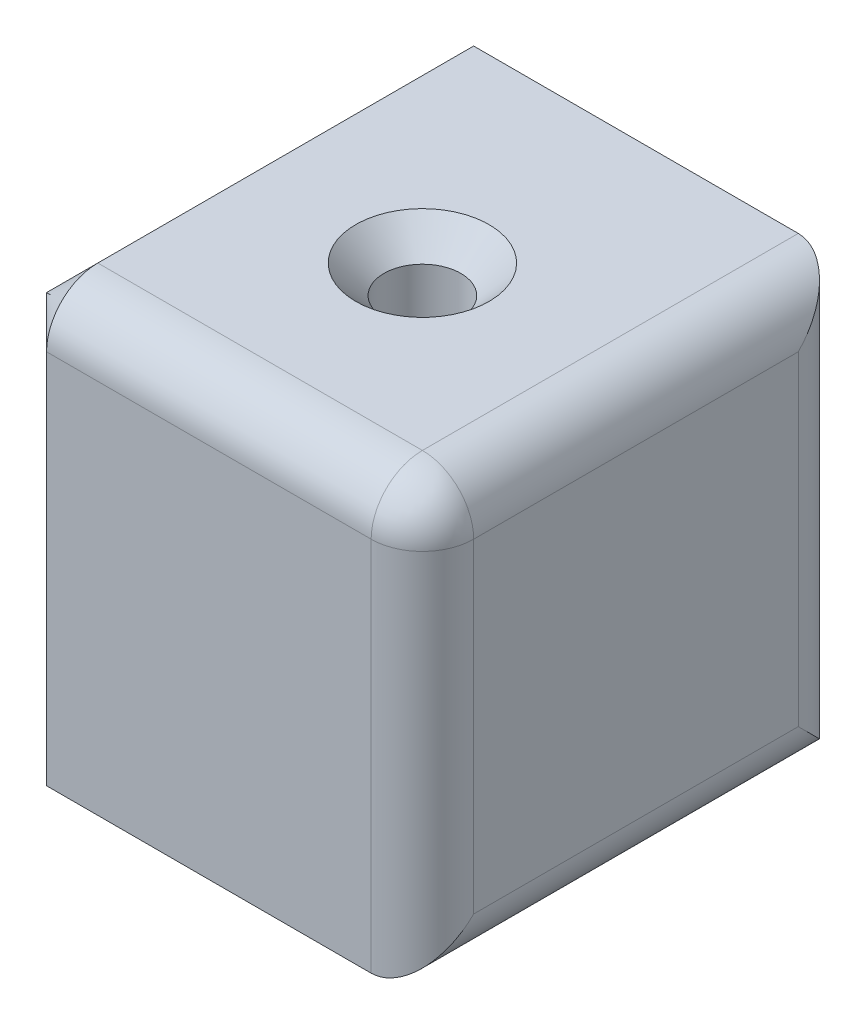
ISO-10303-21;
HEADER;
FILE_DESCRIPTION(('STEP AP214'),'2;1');
FILE_NAME('part.step','',(''),(''),'','','');
FILE_SCHEMA(('AUTOMOTIVE_DESIGN { 1 0 10303 214 1 1 1 1 }'));
ENDSEC;
DATA;
#1=APPLICATION_CONTEXT('core data for automotive mechanical design processes');
#2=APPLICATION_PROTOCOL_DEFINITION('international standard','automotive_design',2000,#1);
#3=PRODUCT_CONTEXT('',#1,'mechanical');
#4=PRODUCT('Part','Part','',(#3));
#5=PRODUCT_RELATED_PRODUCT_CATEGORY('part','',(#4));
#6=PRODUCT_DEFINITION_FORMATION('','',#4);
#7=PRODUCT_DEFINITION_CONTEXT('part definition',#1,'design');
#8=PRODUCT_DEFINITION('design','',#6,#7);
#9=PRODUCT_DEFINITION_SHAPE('','',#8);
#10=(LENGTH_UNIT() NAMED_UNIT(*) SI_UNIT(.MILLI.,.METRE.));
#11=(NAMED_UNIT(*) PLANE_ANGLE_UNIT() SI_UNIT($,.RADIAN.));
#12=(NAMED_UNIT(*) SI_UNIT($,.STERADIAN.) SOLID_ANGLE_UNIT());
#13=UNCERTAINTY_MEASURE_WITH_UNIT(LENGTH_MEASURE(1.E-05),#10,'distance_accuracy_value','');
#14=(GEOMETRIC_REPRESENTATION_CONTEXT(3) GLOBAL_UNCERTAINTY_ASSIGNED_CONTEXT((#13)) GLOBAL_UNIT_ASSIGNED_CONTEXT((#10,
#11,#12)) REPRESENTATION_CONTEXT('',''));
#15=CARTESIAN_POINT('',(0.,0.,0.));
#16=DIRECTION('',(0.,0.,1.));
#17=DIRECTION('',(1.,0.,0.));
#18=AXIS2_PLACEMENT_3D('',#15,#16,#17);
#19=CARTESIAN_POINT('',(0.,0.,25.));
#20=DIRECTION('',(1.,0.,0.));
#21=DIRECTION('',(0.,0.,-1.));
#22=AXIS2_PLACEMENT_3D('',#19,#20,#21);
#23=PLANE('',#22);
#24=DIRECTION('',(0.,0.,-1.));
#25=VECTOR('',#24,1.);
#26=CARTESIAN_POINT('',(0.,22.,25.));
#27=LINE('',#26,#25);
#28=CARTESIAN_POINT('',(0.,22.,22.));
#29=VERTEX_POINT('',#28);
#30=CARTESIAN_POINT('',(0.,22.,4.65685424949239));
#31=VERTEX_POINT('',#30);
#32=EDGE_CURVE('E184',#29,#31,#27,.T.);
#33=ORIENTED_EDGE('',*,*,#32,.T.);
#34=DIRECTION('',(0.,-1.,0.));
#35=VECTOR('',#34,1.);
#36=CARTESIAN_POINT('',(0.,3.00000000000001,4.65685424949239));
#37=LINE('',#36,#35);
#38=CARTESIAN_POINT('',(0.,3.00000000000001,4.65685424949239));
#39=VERTEX_POINT('',#38);
#40=EDGE_CURVE('E198',#31,#39,#37,.T.);
#41=ORIENTED_EDGE('',*,*,#40,.T.);
#42=DIRECTION('',(0.,0.,1.));
#43=VECTOR('',#42,1.);
#44=CARTESIAN_POINT('',(0.,3.00000000000001,25.));
#45=LINE('',#44,#43);
#46=CARTESIAN_POINT('',(0.,3.00000000000001,22.));
#47=VERTEX_POINT('',#46);
#48=EDGE_CURVE('E187',#39,#47,#45,.T.);
#49=ORIENTED_EDGE('',*,*,#48,.T.);
#50=DIRECTION('',(0.,1.,0.));
#51=VECTOR('',#50,1.);
#52=CARTESIAN_POINT('',(0.,0.,22.));
#53=LINE('',#52,#51);
#54=EDGE_CURVE('E182',#47,#29,#53,.T.);
#55=ORIENTED_EDGE('',*,*,#54,.T.);
#56=EDGE_LOOP('',(#33,#41,#49,#55));
#57=FACE_BOUND('',#56,.T.);
#58=ADVANCED_FACE('F47',(#57),#23,.F.);
#59=CARTESIAN_POINT('',(0.,0.,25.));
#60=DIRECTION('',(0.,1.,0.));
#61=DIRECTION('',(0.,0.,1.));
#62=AXIS2_PLACEMENT_3D('',#59,#60,#61);
#63=PLANE('',#62);
#64=CARTESIAN_POINT('',(12.5,0.,12.5));
#65=DIRECTION('',(0.,1.,0.));
#66=DIRECTION('',(0.,0.,1.));
#67=AXIS2_PLACEMENT_3D('',#64,#65,#66);
#68=CIRCLE('',#67,2.25);
#69=CARTESIAN_POINT('',(12.5,0.,14.75));
#70=VERTEX_POINT('',#69);
#71=EDGE_CURVE('E438',#70,#70,#68,.T.);
#72=ORIENTED_EDGE('',*,*,#71,.T.);
#73=EDGE_LOOP('',(#72));
#74=FACE_BOUND('',#73,.T.);
#75=DIRECTION('',(1.,0.,0.));
#76=VECTOR('',#75,1.);
#77=CARTESIAN_POINT('',(0.,0.,25.));
#78=LINE('',#77,#76);
#79=CARTESIAN_POINT('',(3.00000000000001,0.,25.));
#80=VERTEX_POINT('',#79);
#81=CARTESIAN_POINT('',(22.,0.,25.));
#82=VERTEX_POINT('',#81);
#83=EDGE_CURVE('E144',#80,#82,#78,.T.);
#84=ORIENTED_EDGE('',*,*,#83,.F.);
#85=DIRECTION('',(0.,0.,-1.));
#86=VECTOR('',#85,1.);
#87=CARTESIAN_POINT('',(3.00000000000001,0.,25.));
#88=LINE('',#87,#86);
#89=CARTESIAN_POINT('',(3.00000000000001,0.,0.));
#90=VERTEX_POINT('',#89);
#91=EDGE_CURVE('E166',#80,#90,#88,.T.);
#92=ORIENTED_EDGE('',*,*,#91,.T.);
#93=DIRECTION('',(1.,0.,0.));
#94=VECTOR('',#93,1.);
#95=CARTESIAN_POINT('',(0.,0.,0.));
#96=LINE('',#95,#94);
#97=CARTESIAN_POINT('',(22.,0.,0.));
#98=VERTEX_POINT('',#97);
#99=EDGE_CURVE('E435',#90,#98,#96,.T.);
#100=ORIENTED_EDGE('',*,*,#99,.T.);
#101=DIRECTION('',(0.,0.,-1.));
#102=VECTOR('',#101,1.);
#103=CARTESIAN_POINT('',(22.,0.,25.));
#104=LINE('',#103,#102);
#105=EDGE_CURVE('E130',#98,#82,#104,.F.);
#106=ORIENTED_EDGE('',*,*,#105,.T.);
#107=EDGE_LOOP('',(#84,#92,#100,#106));
#108=FACE_BOUND('',#107,.T.);
#109=ADVANCED_FACE('F240',(#74,#108),#63,.F.);
#110=CARTESIAN_POINT('',(25.,0.,25.));
#111=DIRECTION('',(-1.,0.,0.));
#112=DIRECTION('',(0.,0.,1.));
#113=AXIS2_PLACEMENT_3D('',#110,#111,#112);
#114=PLANE('',#113);
#115=DIRECTION('',(0.,1.,0.));
#116=VECTOR('',#115,1.);
#117=CARTESIAN_POINT('',(25.,0.,22.));
#118=LINE('',#117,#116);
#119=CARTESIAN_POINT('',(25.,22.,22.));
#120=VERTEX_POINT('',#119);
#121=CARTESIAN_POINT('',(25.,3.,22.));
#122=VERTEX_POINT('',#121);
#123=EDGE_CURVE('E148',#120,#122,#118,.F.);
#124=ORIENTED_EDGE('',*,*,#123,.T.);
#125=DIRECTION('',(0.,0.,-1.));
#126=VECTOR('',#125,1.);
#127=CARTESIAN_POINT('',(25.,3.,25.));
#128=LINE('',#127,#126);
#129=CARTESIAN_POINT('',(25.,3.,3.));
#130=VERTEX_POINT('',#129);
#131=EDGE_CURVE('E128',#122,#130,#128,.T.);
#132=ORIENTED_EDGE('',*,*,#131,.T.);
#133=DIRECTION('',(0.,1.,0.));
#134=VECTOR('',#133,1.);
#135=CARTESIAN_POINT('',(25.,25.,3.));
#136=LINE('',#135,#134);
#137=CARTESIAN_POINT('',(25.,22.,3.));
#138=VERTEX_POINT('',#137);
#139=EDGE_CURVE('E137',#130,#138,#136,.T.);
#140=ORIENTED_EDGE('',*,*,#139,.T.);
#141=DIRECTION('',(0.,0.,-1.));
#142=VECTOR('',#141,1.);
#143=CARTESIAN_POINT('',(25.,22.,25.));
#144=LINE('',#143,#142);
#145=EDGE_CURVE('E143',#138,#120,#144,.F.);
#146=ORIENTED_EDGE('',*,*,#145,.T.);
#147=EDGE_LOOP('',(#124,#132,#140,#146));
#148=FACE_BOUND('',#147,.T.);
#149=ADVANCED_FACE('F146',(#148),#114,.F.);
#150=CARTESIAN_POINT('',(0.,25.,25.));
#151=DIRECTION('',(0.,-1.,0.));
#152=DIRECTION('',(0.,0.,-1.));
#153=AXIS2_PLACEMENT_3D('',#150,#151,#152);
#154=PLANE('',#153);
#155=CARTESIAN_POINT('',(12.5,25.,12.5));
#156=DIRECTION('',(0.,1.,0.));
#157=DIRECTION('',(0.,0.,1.));
#158=AXIS2_PLACEMENT_3D('',#155,#156,#157);
#159=CIRCLE('',#158,3.9);
#160=CARTESIAN_POINT('',(12.5,25.,16.4));
#161=VERTEX_POINT('',#160);
#162=EDGE_CURVE('E179',#161,#161,#159,.T.);
#163=ORIENTED_EDGE('',*,*,#162,.F.);
#164=EDGE_LOOP('',(#163));
#165=FACE_BOUND('',#164,.T.);
#166=DIRECTION('',(-1.,0.,0.));
#167=VECTOR('',#166,1.);
#168=CARTESIAN_POINT('',(0.,25.,0.));
#169=LINE('',#168,#167);
#170=CARTESIAN_POINT('',(22.,25.,0.));
#171=VERTEX_POINT('',#170);
#172=CARTESIAN_POINT('',(3.00000000000001,25.,0.));
#173=VERTEX_POINT('',#172);
#174=EDGE_CURVE('E432',#171,#173,#169,.T.);
#175=ORIENTED_EDGE('',*,*,#174,.T.);
#176=DIRECTION('',(0.,0.,1.));
#177=VECTOR('',#176,1.);
#178=CARTESIAN_POINT('',(3.00000000000001,25.,25.));
#179=LINE('',#178,#177);
#180=CARTESIAN_POINT('',(3.00000000000001,25.,22.));
#181=VERTEX_POINT('',#180);
#182=EDGE_CURVE('E192',#173,#181,#179,.T.);
#183=ORIENTED_EDGE('',*,*,#182,.T.);
#184=DIRECTION('',(-1.,0.,0.));
#185=VECTOR('',#184,1.);
#186=CARTESIAN_POINT('',(0.,25.,22.));
#187=LINE('',#186,#185);
#188=CARTESIAN_POINT('',(22.,25.,22.));
#189=VERTEX_POINT('',#188);
#190=EDGE_CURVE('E160',#181,#189,#187,.F.);
#191=ORIENTED_EDGE('',*,*,#190,.T.);
#192=DIRECTION('',(0.,0.,-1.));
#193=VECTOR('',#192,1.);
#194=CARTESIAN_POINT('',(22.,25.,25.));
#195=LINE('',#194,#193);
#196=EDGE_CURVE('E162',#189,#171,#195,.T.);
#197=ORIENTED_EDGE('',*,*,#196,.T.);
#198=EDGE_LOOP('',(#175,#183,#191,#197));
#199=FACE_BOUND('',#198,.T.);
#200=ADVANCED_FACE('F388',(#165,#199),#154,.F.);
#201=CARTESIAN_POINT('',(0.,0.,25.));
#202=DIRECTION('',(0.,0.,-1.));
#203=DIRECTION('',(-1.,0.,0.));
#204=AXIS2_PLACEMENT_3D('',#201,#202,#203);
#205=PLANE('',#204);
#206=DIRECTION('',(-1.,0.,0.));
#207=VECTOR('',#206,1.);
#208=CARTESIAN_POINT('',(0.,22.,25.));
#209=LINE('',#208,#207);
#210=CARTESIAN_POINT('',(22.,22.,25.));
#211=VERTEX_POINT('',#210);
#212=CARTESIAN_POINT('',(3.00000000000001,22.,25.));
#213=VERTEX_POINT('',#212);
#214=EDGE_CURVE('E151',#211,#213,#209,.T.);
#215=ORIENTED_EDGE('',*,*,#214,.T.);
#216=DIRECTION('',(0.,-1.,0.));
#217=VECTOR('',#216,1.);
#218=CARTESIAN_POINT('',(3.00000000000001,0.,25.));
#219=LINE('',#218,#217);
#220=EDGE_CURVE('E196',#213,#80,#219,.T.);
#221=ORIENTED_EDGE('',*,*,#220,.T.);
#222=ORIENTED_EDGE('',*,*,#83,.T.);
#223=DIRECTION('',(0.,1.,0.));
#224=VECTOR('',#223,1.);
#225=CARTESIAN_POINT('',(22.,0.,25.));
#226=LINE('',#225,#224);
#227=EDGE_CURVE('E158',#82,#211,#226,.T.);
#228=ORIENTED_EDGE('',*,*,#227,.T.);
#229=EDGE_LOOP('',(#215,#221,#222,#228));
#230=FACE_BOUND('',#229,.T.);
#231=ADVANCED_FACE('F379',(#230),#205,.F.);
#232=CARTESIAN_POINT('',(0.,0.,0.));
#233=DIRECTION('',(0.,0.,-1.));
#234=DIRECTION('',(-1.,0.,0.));
#235=AXIS2_PLACEMENT_3D('',#232,#233,#234);
#236=PLANE('',#235);
#237=ORIENTED_EDGE('',*,*,#99,.F.);
#238=DIRECTION('',(0.,1.,0.));
#239=VECTOR('',#238,1.);
#240=CARTESIAN_POINT('',(3.00000000000001,25.,0.));
#241=LINE('',#240,#239);
#242=EDGE_CURVE('E189',#90,#173,#241,.T.);
#243=ORIENTED_EDGE('',*,*,#242,.T.);
#244=ORIENTED_EDGE('',*,*,#174,.F.);
#245=DIRECTION('',(0.,1.,0.));
#246=VECTOR('',#245,1.);
#247=CARTESIAN_POINT('',(22.,0.,0.));
#248=LINE('',#247,#246);
#249=EDGE_CURVE('E164',#171,#98,#248,.F.);
#250=ORIENTED_EDGE('',*,*,#249,.T.);
#251=EDGE_LOOP('',(#237,#243,#244,#250));
#252=FACE_BOUND('',#251,.T.);
#253=ADVANCED_FACE('F371',(#252),#236,.T.);
#254=CARTESIAN_POINT('',(12.5,25.,12.5));
#255=DIRECTION('',(0.,1.,0.));
#256=DIRECTION('',(0.,0.,1.));
#257=AXIS2_PLACEMENT_3D('',#254,#255,#256);
#258=CYLINDRICAL_SURFACE('',#257,2.25);
#259=ORIENTED_EDGE('',*,*,#71,.F.);
#260=EDGE_LOOP('',(#259));
#261=FACE_BOUND('',#260,.T.);
#262=CARTESIAN_POINT('',(12.5,23.35,12.5));
#263=DIRECTION('',(0.,1.,0.));
#264=DIRECTION('',(0.,0.,1.));
#265=AXIS2_PLACEMENT_3D('',#262,#263,#264);
#266=CIRCLE('',#265,2.25);
#267=CARTESIAN_POINT('',(12.5,23.35,14.75));
#268=VERTEX_POINT('',#267);
#269=EDGE_CURVE('E452',#268,#268,#266,.T.);
#270=ORIENTED_EDGE('',*,*,#269,.T.);
#271=EDGE_LOOP('',(#270));
#272=FACE_BOUND('',#271,.T.);
#273=ADVANCED_FACE('F362',(#261,#272),#258,.F.);
#274=CARTESIAN_POINT('',(12.5,25.,12.5));
#275=DIRECTION('',(0.,1.,0.));
#276=DIRECTION('',(0.,0.,1.));
#277=AXIS2_PLACEMENT_3D('',#274,#275,#276);
#278=CONICAL_SURFACE('',#277,3.9,0.785398163397443);
#279=ORIENTED_EDGE('',*,*,#269,.F.);
#280=EDGE_LOOP('',(#279));
#281=FACE_BOUND('',#280,.T.);
#282=ORIENTED_EDGE('',*,*,#162,.T.);
#283=EDGE_LOOP('',(#282));
#284=FACE_BOUND('',#283,.T.);
#285=ADVANCED_FACE('F269',(#281,#284),#278,.F.);
#286=CARTESIAN_POINT('',(0.,22.,22.));
#287=DIRECTION('',(-1.,0.,0.));
#288=DIRECTION('',(0.,0.,1.));
#289=AXIS2_PLACEMENT_3D('',#286,#287,#288);
#290=CYLINDRICAL_SURFACE('',#289,3.);
#291=ORIENTED_EDGE('',*,*,#190,.F.);
#292=CARTESIAN_POINT('',(3.00000000000001,22.,22.));
#293=DIRECTION('',(1.,0.,0.));
#294=DIRECTION('',(0.,0.,-1.));
#295=AXIS2_PLACEMENT_3D('',#292,#293,#294);
#296=CIRCLE('',#295,3.);
#297=EDGE_CURVE('E194',#181,#213,#296,.T.);
#298=ORIENTED_EDGE('',*,*,#297,.T.);
#299=ORIENTED_EDGE('',*,*,#214,.F.);
#300=CARTESIAN_POINT('',(22.,22.,22.));
#301=DIRECTION('',(1.,0.,0.));
#302=DIRECTION('',(0.,0.,-1.));
#303=AXIS2_PLACEMENT_3D('',#300,#301,#302);
#304=CIRCLE('',#303,3.);
#305=EDGE_CURVE('E176',#189,#211,#304,.T.);
#306=ORIENTED_EDGE('',*,*,#305,.F.);
#307=EDGE_LOOP('',(#291,#298,#299,#306));
#308=FACE_BOUND('',#307,.T.);
#309=ADVANCED_FACE('F266',(#308),#290,.T.);
#310=CARTESIAN_POINT('',(22.,22.,22.));
#311=DIRECTION('',(0.,1.,0.));
#312=DIRECTION('',(0.,0.,1.));
#313=AXIS2_PLACEMENT_3D('',#310,#311,#312);
#314=SPHERICAL_SURFACE('',#313,3.);
#315=CARTESIAN_POINT('',(22.,22.,22.));
#316=DIRECTION('',(0.,1.,0.));
#317=DIRECTION('',(0.,0.,1.));
#318=AXIS2_PLACEMENT_3D('',#315,#316,#317);
#319=CIRCLE('',#318,3.);
#320=EDGE_CURVE('E170',#120,#211,#319,.F.);
#321=ORIENTED_EDGE('',*,*,#320,.F.);
#322=CARTESIAN_POINT('',(22.,22.,22.));
#323=DIRECTION('',(0.,0.,1.));
#324=DIRECTION('',(1.,0.,0.));
#325=AXIS2_PLACEMENT_3D('',#322,#323,#324);
#326=CIRCLE('',#325,3.);
#327=EDGE_CURVE('E173',#189,#120,#326,.F.);
#328=ORIENTED_EDGE('',*,*,#327,.F.);
#329=ORIENTED_EDGE('',*,*,#305,.T.);
#330=EDGE_LOOP('',(#321,#328,#329));
#331=FACE_BOUND('',#330,.T.);
#332=ADVANCED_FACE('F262',(#331),#314,.T.);
#333=CARTESIAN_POINT('',(22.,22.,25.));
#334=DIRECTION('',(0.,0.,-1.));
#335=DIRECTION('',(-1.,0.,0.));
#336=AXIS2_PLACEMENT_3D('',#333,#334,#335);
#337=CYLINDRICAL_SURFACE('',#336,3.);
#338=ORIENTED_EDGE('',*,*,#327,.T.);
#339=ORIENTED_EDGE('',*,*,#145,.F.);
#340=CARTESIAN_POINT('',(22.,22.,3.));
#341=DIRECTION('',(0.,-0.707106781186547,-0.707106781186547));
#342=DIRECTION('',(0.,-0.707106781186547,0.707106781186547));
#343=AXIS2_PLACEMENT_3D('',#340,#341,#342);
#344=ELLIPSE('',#343,4.24264068711928,3.);
#345=EDGE_CURVE('E140',#171,#138,#344,.T.);
#346=ORIENTED_EDGE('',*,*,#345,.F.);
#347=ORIENTED_EDGE('',*,*,#196,.F.);
#348=EDGE_LOOP('',(#338,#339,#346,#347));
#349=FACE_BOUND('',#348,.T.);
#350=ADVANCED_FACE('F258',(#349),#337,.T.);
#351=CARTESIAN_POINT('',(22.,0.,22.));
#352=DIRECTION('',(0.,1.,0.));
#353=DIRECTION('',(0.,0.,1.));
#354=AXIS2_PLACEMENT_3D('',#351,#352,#353);
#355=CYLINDRICAL_SURFACE('',#354,3.);
#356=ORIENTED_EDGE('',*,*,#320,.T.);
#357=ORIENTED_EDGE('',*,*,#227,.F.);
#358=CARTESIAN_POINT('',(22.,3.,22.));
#359=DIRECTION('',(0.,0.707106781186547,0.707106781186547));
#360=DIRECTION('',(0.,0.707106781186547,-0.707106781186547));
#361=AXIS2_PLACEMENT_3D('',#358,#359,#360);
#362=ELLIPSE('',#361,4.24264068711928,3.);
#363=EDGE_CURVE('E133',#122,#82,#362,.F.);
#364=ORIENTED_EDGE('',*,*,#363,.F.);
#365=ORIENTED_EDGE('',*,*,#123,.F.);
#366=EDGE_LOOP('',(#356,#357,#364,#365));
#367=FACE_BOUND('',#366,.T.);
#368=ADVANCED_FACE('F255',(#367),#355,.T.);
#369=CARTESIAN_POINT('',(22.,0.,3.));
#370=DIRECTION('',(0.,-1.,0.));
#371=DIRECTION('',(0.,0.,-1.));
#372=AXIS2_PLACEMENT_3D('',#369,#370,#371);
#373=CYLINDRICAL_SURFACE('',#372,3.);
#374=ORIENTED_EDGE('',*,*,#345,.T.);
#375=ORIENTED_EDGE('',*,*,#139,.F.);
#376=CARTESIAN_POINT('',(22.,3.,3.));
#377=DIRECTION('',(0.,-0.707106781186547,0.707106781186547));
#378=DIRECTION('',(0.,-0.707106781186547,-0.707106781186547));
#379=AXIS2_PLACEMENT_3D('',#376,#377,#378);
#380=ELLIPSE('',#379,4.24264068711928,3.);
#381=EDGE_CURVE('E123',#98,#130,#380,.T.);
#382=ORIENTED_EDGE('',*,*,#381,.F.);
#383=ORIENTED_EDGE('',*,*,#249,.F.);
#384=EDGE_LOOP('',(#374,#375,#382,#383));
#385=FACE_BOUND('',#384,.T.);
#386=ADVANCED_FACE('F138',(#385),#373,.T.);
#387=CARTESIAN_POINT('',(22.,3.,25.));
#388=DIRECTION('',(0.,0.,-1.));
#389=DIRECTION('',(-1.,0.,0.));
#390=AXIS2_PLACEMENT_3D('',#387,#388,#389);
#391=CYLINDRICAL_SURFACE('',#390,3.);
#392=ORIENTED_EDGE('',*,*,#363,.T.);
#393=ORIENTED_EDGE('',*,*,#105,.F.);
#394=ORIENTED_EDGE('',*,*,#381,.T.);
#395=ORIENTED_EDGE('',*,*,#131,.F.);
#396=EDGE_LOOP('',(#392,#393,#394,#395));
#397=FACE_BOUND('',#396,.T.);
#398=ADVANCED_FACE('F126',(#397),#391,.T.);
#399=CARTESIAN_POINT('',(3.00000000000001,22.,22.));
#400=DIRECTION('',(1.,0.,0.));
#401=DIRECTION('',(0.,0.,-1.));
#402=AXIS2_PLACEMENT_3D('',#399,#400,#401);
#403=CONICAL_SURFACE('',#402,3.00000000000001,0.785398163397448);
#404=DIRECTION('',(-0.707106781186547,0.,-0.707106781186547));
#405=VECTOR('',#404,1.);
#406=CARTESIAN_POINT('',(3.00000000000001,22.,25.));
#407=LINE('',#406,#405);
#408=EDGE_CURVE('E206',#213,#29,#407,.T.);
#409=ORIENTED_EDGE('',*,*,#408,.F.);
#410=ORIENTED_EDGE('',*,*,#297,.F.);
#411=DIRECTION('',(0.707106781186547,0.707106781186547,0.));
#412=VECTOR('',#411,1.);
#413=CARTESIAN_POINT('',(0.,22.,22.));
#414=LINE('',#413,#412);
#415=EDGE_CURVE('E134',#29,#181,#414,.T.);
#416=ORIENTED_EDGE('',*,*,#415,.F.);
#417=EDGE_LOOP('',(#409,#410,#416));
#418=FACE_BOUND('',#417,.T.);
#419=ADVANCED_FACE('F229',(#418),#403,.T.);
#420=CARTESIAN_POINT('',(0.,22.,25.));
#421=DIRECTION('',(0.707106781186547,-0.707106781186547,0.));
#422=DIRECTION('',(0.,0.,-1.));
#423=AXIS2_PLACEMENT_3D('',#420,#421,#422);
#424=PLANE('',#423);
#425=DIRECTION('',(0.577350269189626,0.577350269189626,-0.577350269189626));
#426=VECTOR('',#425,1.);
#427=CARTESIAN_POINT('',(-7.33333333333333,14.6666666666667,10.3333333333333));
#428=LINE('',#427,#426);
#429=CARTESIAN_POINT('',(1.17157287525381,23.1715728752538,1.8284271247462));
#430=VERTEX_POINT('',#429);
#431=EDGE_CURVE('E204',#430,#173,#428,.T.);
#432=ORIENTED_EDGE('',*,*,#431,.F.);
#433=CARTESIAN_POINT('',(4.,26.,4.65685424949239));
#434=DIRECTION('',(0.707106781186547,-0.707106781186547,0.));
#435=DIRECTION('',(0.707106781186548,0.707106781186548,0.));
#436=AXIS2_PLACEMENT_3D('',#433,#434,#435);
#437=ELLIPSE('',#436,5.65685424949238,4.);
#438=EDGE_CURVE('E11',#430,#31,#437,.F.);
#439=ORIENTED_EDGE('',*,*,#438,.T.);
#440=ORIENTED_EDGE('',*,*,#32,.F.);
#441=ORIENTED_EDGE('',*,*,#415,.T.);
#442=ORIENTED_EDGE('',*,*,#182,.F.);
#443=EDGE_LOOP('',(#432,#439,#440,#441,#442));
#444=FACE_BOUND('',#443,.T.);
#445=ADVANCED_FACE('F232',(#444),#424,.F.);
#446=CARTESIAN_POINT('',(3.00000000000001,0.,25.));
#447=DIRECTION('',(0.707106781186547,0.,-0.707106781186547));
#448=DIRECTION('',(0.,-1.,0.));
#449=AXIS2_PLACEMENT_3D('',#446,#447,#448);
#450=PLANE('',#449);
#451=ORIENTED_EDGE('',*,*,#408,.T.);
#452=ORIENTED_EDGE('',*,*,#54,.F.);
#453=DIRECTION('',(0.577350269189626,-0.577350269189626,0.577350269189626));
#454=VECTOR('',#453,1.);
#455=CARTESIAN_POINT('',(3.00000000000001,0.,25.));
#456=LINE('',#455,#454);
#457=EDGE_CURVE('E201',#80,#47,#456,.F.);
#458=ORIENTED_EDGE('',*,*,#457,.F.);
#459=ORIENTED_EDGE('',*,*,#220,.F.);
#460=EDGE_LOOP('',(#451,#452,#458,#459));
#461=FACE_BOUND('',#460,.T.);
#462=ADVANCED_FACE('F224',(#461),#450,.F.);
#463=CARTESIAN_POINT('',(0.,0.,3.00000000000001));
#464=DIRECTION('',(-0.707106781186547,0.,-0.707106781186547));
#465=DIRECTION('',(0.,1.,0.));
#466=AXIS2_PLACEMENT_3D('',#463,#464,#465);
#467=PLANE('',#466);
#468=DIRECTION('',(0.577350269189626,-0.577350269189626,-0.577350269189626));
#469=VECTOR('',#468,1.);
#470=CARTESIAN_POINT('',(1.,2.00000000000001,2.00000000000001));
#471=LINE('',#470,#469);
#472=CARTESIAN_POINT('',(1.17157287525381,1.8284271247462,1.8284271247462));
#473=VERTEX_POINT('',#472);
#474=EDGE_CURVE('E199',#473,#90,#471,.T.);
#475=ORIENTED_EDGE('',*,*,#474,.F.);
#476=DIRECTION('',(0.,-1.,0.));
#477=VECTOR('',#476,1.);
#478=CARTESIAN_POINT('',(1.17157287525381,22.,1.8284271247462));
#479=LINE('',#478,#477);
#480=EDGE_CURVE('E55',#473,#430,#479,.F.);
#481=ORIENTED_EDGE('',*,*,#480,.T.);
#482=ORIENTED_EDGE('',*,*,#431,.T.);
#483=ORIENTED_EDGE('',*,*,#242,.F.);
#484=EDGE_LOOP('',(#475,#481,#482,#483));
#485=FACE_BOUND('',#484,.T.);
#486=ADVANCED_FACE('F237',(#485),#467,.T.);
#487=CARTESIAN_POINT('',(3.00000000000001,0.,25.));
#488=DIRECTION('',(0.707106781186547,0.707106781186547,0.));
#489=DIRECTION('',(0.,0.,-1.));
#490=AXIS2_PLACEMENT_3D('',#487,#488,#489);
#491=PLANE('',#490);
#492=ORIENTED_EDGE('',*,*,#48,.F.);
#493=CARTESIAN_POINT('',(4.,-0.99999999999999,4.65685424949239));
#494=DIRECTION('',(0.707106781186547,0.707106781186547,0.));
#495=DIRECTION('',(-0.707106781186548,0.707106781186548,0.));
#496=AXIS2_PLACEMENT_3D('',#493,#494,#495);
#497=ELLIPSE('',#496,5.65685424949238,4.);
#498=EDGE_CURVE('E69',#39,#473,#497,.F.);
#499=ORIENTED_EDGE('',*,*,#498,.T.);
#500=ORIENTED_EDGE('',*,*,#474,.T.);
#501=ORIENTED_EDGE('',*,*,#91,.F.);
#502=ORIENTED_EDGE('',*,*,#457,.T.);
#503=EDGE_LOOP('',(#492,#499,#500,#501,#502));
#504=FACE_BOUND('',#503,.T.);
#505=ADVANCED_FACE('F218',(#504),#491,.F.);
#506=CARTESIAN_POINT('',(4.,0.,4.65685424949239));
#507=DIRECTION('',(0.,1.,0.));
#508=DIRECTION('',(0.,0.,1.));
#509=AXIS2_PLACEMENT_3D('',#506,#507,#508);
#510=CYLINDRICAL_SURFACE('',#509,4.);
#511=ORIENTED_EDGE('',*,*,#438,.F.);
#512=ORIENTED_EDGE('',*,*,#480,.F.);
#513=ORIENTED_EDGE('',*,*,#498,.F.);
#514=ORIENTED_EDGE('',*,*,#40,.F.);
#515=EDGE_LOOP('',(#511,#512,#513,#514));
#516=FACE_BOUND('',#515,.T.);
#517=ADVANCED_FACE('F49',(#516),#510,.T.);
#518=CLOSED_SHELL('',(#58,#109,#149,#200,#231,#253,#273,#285,#309,#332,#350,#368,#386,#398,#419,
#445,#462,#486,#505,#517));
#519=MANIFOLD_SOLID_BREP('B2',#518);
#520=ADVANCED_BREP_SHAPE_REPRESENTATION('',(#18,#519),#14);
#521=SHAPE_DEFINITION_REPRESENTATION(#9,#520);
ENDSEC;
END-ISO-10303-21;
